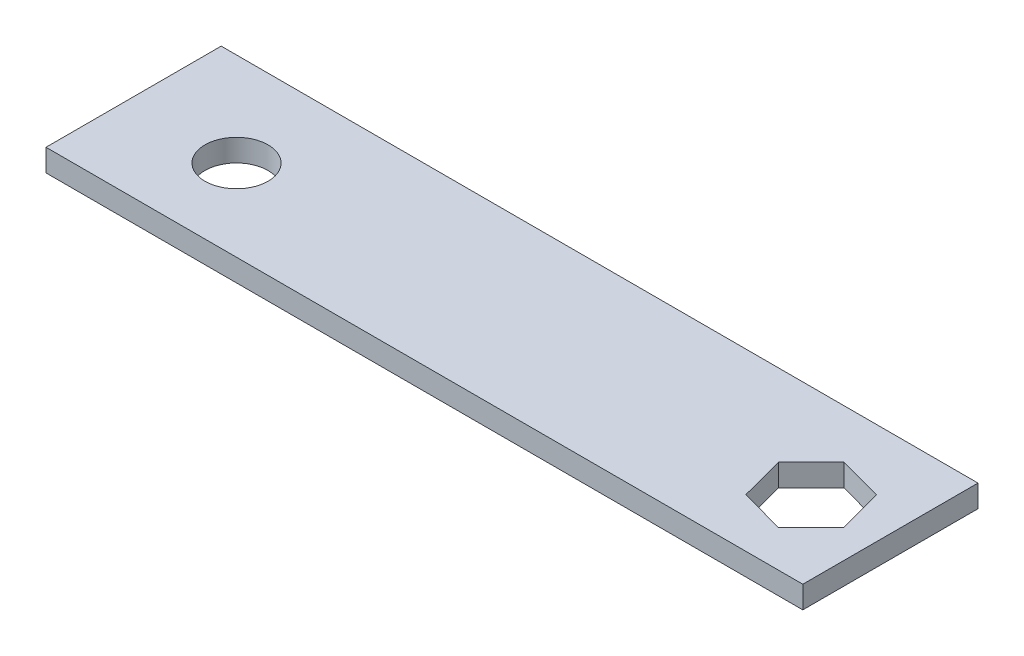
ISO-10303-21;
HEADER;
FILE_DESCRIPTION(('STEP AP214'),'2;1');
FILE_NAME('part.step','',(''),(''),'','','');
FILE_SCHEMA(('AUTOMOTIVE_DESIGN { 1 0 10303 214 1 1 1 1 }'));
ENDSEC;
DATA;
#1=APPLICATION_CONTEXT('core data for automotive mechanical design processes');
#2=APPLICATION_PROTOCOL_DEFINITION('international standard','automotive_design',2000,#1);
#3=PRODUCT_CONTEXT('',#1,'mechanical');
#4=PRODUCT('Part','Part','',(#3));
#5=PRODUCT_RELATED_PRODUCT_CATEGORY('part','',(#4));
#6=PRODUCT_DEFINITION_FORMATION('','',#4);
#7=PRODUCT_DEFINITION_CONTEXT('part definition',#1,'design');
#8=PRODUCT_DEFINITION('design','',#6,#7);
#9=PRODUCT_DEFINITION_SHAPE('','',#8);
#10=(LENGTH_UNIT() NAMED_UNIT(*) SI_UNIT(.MILLI.,.METRE.));
#11=(NAMED_UNIT(*) PLANE_ANGLE_UNIT() SI_UNIT($,.RADIAN.));
#12=(NAMED_UNIT(*) SI_UNIT($,.STERADIAN.) SOLID_ANGLE_UNIT());
#13=UNCERTAINTY_MEASURE_WITH_UNIT(LENGTH_MEASURE(1.E-05),#10,'distance_accuracy_value','');
#14=(GEOMETRIC_REPRESENTATION_CONTEXT(3) GLOBAL_UNCERTAINTY_ASSIGNED_CONTEXT((#13)) GLOBAL_UNIT_ASSIGNED_CONTEXT((#10,
#11,#12)) REPRESENTATION_CONTEXT('',''));
#15=CARTESIAN_POINT('',(0.,0.,0.));
#16=DIRECTION('',(0.,0.,1.));
#17=DIRECTION('',(1.,0.,0.));
#18=AXIS2_PLACEMENT_3D('',#15,#16,#17);
#19=CARTESIAN_POINT('',(0.,3.175,0.));
#20=DIRECTION('',(0.,-1.,0.));
#21=DIRECTION('',(0.,0.,-1.));
#22=AXIS2_PLACEMENT_3D('',#19,#20,#21);
#23=PLANE('',#22);
#24=CARTESIAN_POINT('',(15.5424302003299,3.175,-11.6447028027576));
#25=DIRECTION('',(0.,1.,0.));
#26=DIRECTION('',(0.,0.,1.));
#27=AXIS2_PLACEMENT_3D('',#24,#25,#26);
#28=CIRCLE('',#27,4.49999999995964);
#29=CARTESIAN_POINT('',(15.5424302003299,3.175,-7.14470280279791));
#30=VERTEX_POINT('',#29);
#31=EDGE_CURVE('E186',#30,#30,#28,.T.);
#32=ORIENTED_EDGE('',*,*,#31,.F.);
#33=EDGE_LOOP('',(#32));
#34=FACE_BOUND('',#33,.T.);
#35=DIRECTION('',(0.,0.,1.));
#36=VECTOR('',#35,1.);
#37=CARTESIAN_POINT('',(0.,3.175,0.));
#38=LINE('',#37,#36);
#39=CARTESIAN_POINT('',(0.,3.175,-25.));
#40=VERTEX_POINT('',#39);
#41=CARTESIAN_POINT('',(0.,3.175,0.));
#42=VERTEX_POINT('',#41);
#43=EDGE_CURVE('E194',#40,#42,#38,.T.);
#44=ORIENTED_EDGE('',*,*,#43,.T.);
#45=DIRECTION('',(1.,0.,0.));
#46=VECTOR('',#45,1.);
#47=CARTESIAN_POINT('',(0.,3.175,0.));
#48=LINE('',#47,#46);
#49=CARTESIAN_POINT('',(108.,3.175,0.));
#50=VERTEX_POINT('',#49);
#51=EDGE_CURVE('E198',#42,#50,#48,.T.);
#52=ORIENTED_EDGE('',*,*,#51,.T.);
#53=DIRECTION('',(0.,0.,-1.));
#54=VECTOR('',#53,1.);
#55=CARTESIAN_POINT('',(108.,3.175,0.));
#56=LINE('',#55,#54);
#57=CARTESIAN_POINT('',(108.,3.175,-25.));
#58=VERTEX_POINT('',#57);
#59=EDGE_CURVE('E202',#50,#58,#56,.T.);
#60=ORIENTED_EDGE('',*,*,#59,.T.);
#61=DIRECTION('',(-1.,0.,0.));
#62=VECTOR('',#61,1.);
#63=CARTESIAN_POINT('',(0.,3.175,-25.));
#64=LINE('',#63,#62);
#65=EDGE_CURVE('E205',#58,#40,#64,.T.);
#66=ORIENTED_EDGE('',*,*,#65,.T.);
#67=EDGE_LOOP('',(#44,#52,#60,#66));
#68=FACE_BOUND('',#67,.T.);
#69=DIRECTION('',(-0.965283141639287,0.,-0.261205774183859));
#70=VECTOR('',#69,1.);
#71=CARTESIAN_POINT('',(102.21569432158,3.175,-16.2949216065983));
#72=LINE('',#71,#70);
#73=CARTESIAN_POINT('',(102.21569432158,3.175,-16.2949216065983));
#74=VERTEX_POINT('',#73);
#75=CARTESIAN_POINT('',(95.8518546436722,3.175,-18.0169776522752));
#76=VERTEX_POINT('',#75);
#77=EDGE_CURVE('E117',#74,#76,#72,.T.);
#78=ORIENTED_EDGE('',*,*,#77,.F.);
#79=DIRECTION('',(-0.25643073476124,0.,-0.966562609596404));
#80=VECTOR('',#79,1.);
#81=CARTESIAN_POINT('',(103.906269878237,3.175,-9.92264675708025));
#82=LINE('',#81,#80);
#83=CARTESIAN_POINT('',(103.906269878237,3.175,-9.92264675708025));
#84=VERTEX_POINT('',#83);
#85=EDGE_CURVE('E152',#84,#74,#82,.T.);
#86=ORIENTED_EDGE('',*,*,#85,.F.);
#87=DIRECTION('',(0.708852406878046,0.,-0.705356835412546));
#88=VECTOR('',#87,1.);
#89=CARTESIAN_POINT('',(99.2330057569866,3.175,-5.27242795323908));
#90=LINE('',#89,#88);
#91=CARTESIAN_POINT('',(99.2330057569866,3.175,-5.27242795323908));
#92=VERTEX_POINT('',#91);
#93=EDGE_CURVE('E149',#92,#84,#90,.T.);
#94=ORIENTED_EDGE('',*,*,#93,.F.);
#95=DIRECTION('',(0.965283141639285,0.,0.261205774183866));
#96=VECTOR('',#95,1.);
#97=CARTESIAN_POINT('',(92.8691660790788,3.175,-6.99448399891598));
#98=LINE('',#97,#96);
#99=CARTESIAN_POINT('',(92.8691660790788,3.175,-6.99448399891598));
#100=VERTEX_POINT('',#99);
#101=EDGE_CURVE('E144',#100,#92,#98,.T.);
#102=ORIENTED_EDGE('',*,*,#101,.F.);
#103=DIRECTION('',(0.256430734761242,0.,0.966562609596404));
#104=VECTOR('',#103,1.);
#105=CARTESIAN_POINT('',(91.1785905224216,3.175,-13.366758848434));
#106=LINE('',#105,#104);
#107=CARTESIAN_POINT('',(91.1785905224216,3.175,-13.366758848434));
#108=VERTEX_POINT('',#107);
#109=EDGE_CURVE('E140',#108,#100,#106,.T.);
#110=ORIENTED_EDGE('',*,*,#109,.F.);
#111=DIRECTION('',(-0.708852406878041,0.,0.705356835412551));
#112=VECTOR('',#111,1.);
#113=CARTESIAN_POINT('',(95.8518546436722,3.175,-18.0169776522752));
#114=LINE('',#113,#112);
#115=EDGE_CURVE('E126',#76,#108,#114,.T.);
#116=ORIENTED_EDGE('',*,*,#115,.F.);
#117=EDGE_LOOP('',(#78,#86,#94,#102,#110,#116));
#118=FACE_BOUND('',#117,.T.);
#119=ADVANCED_FACE('F39',(#34,#68,#118),#23,.F.);
#120=CARTESIAN_POINT('',(0.,0.,0.));
#121=DIRECTION('',(0.,-1.,0.));
#122=DIRECTION('',(0.,0.,-1.));
#123=AXIS2_PLACEMENT_3D('',#120,#121,#122);
#124=PLANE('',#123);
#125=DIRECTION('',(0.,0.,1.));
#126=VECTOR('',#125,1.);
#127=CARTESIAN_POINT('',(0.,0.,0.));
#128=LINE('',#127,#126);
#129=CARTESIAN_POINT('',(0.,0.,-25.));
#130=VERTEX_POINT('',#129);
#131=CARTESIAN_POINT('',(0.,0.,0.));
#132=VERTEX_POINT('',#131);
#133=EDGE_CURVE('E190',#130,#132,#128,.T.);
#134=ORIENTED_EDGE('',*,*,#133,.F.);
#135=DIRECTION('',(-1.,0.,0.));
#136=VECTOR('',#135,1.);
#137=CARTESIAN_POINT('',(0.,0.,-25.));
#138=LINE('',#137,#136);
#139=CARTESIAN_POINT('',(108.,0.,-25.));
#140=VERTEX_POINT('',#139);
#141=EDGE_CURVE('E199',#140,#130,#138,.T.);
#142=ORIENTED_EDGE('',*,*,#141,.F.);
#143=DIRECTION('',(0.,0.,-1.));
#144=VECTOR('',#143,1.);
#145=CARTESIAN_POINT('',(108.,0.,0.));
#146=LINE('',#145,#144);
#147=CARTESIAN_POINT('',(108.,0.,0.));
#148=VERTEX_POINT('',#147);
#149=EDGE_CURVE('E215',#148,#140,#146,.T.);
#150=ORIENTED_EDGE('',*,*,#149,.F.);
#151=DIRECTION('',(1.,0.,0.));
#152=VECTOR('',#151,1.);
#153=CARTESIAN_POINT('',(0.,0.,0.));
#154=LINE('',#153,#152);
#155=EDGE_CURVE('E212',#132,#148,#154,.T.);
#156=ORIENTED_EDGE('',*,*,#155,.F.);
#157=EDGE_LOOP('',(#134,#142,#150,#156));
#158=FACE_BOUND('',#157,.T.);
#159=CARTESIAN_POINT('',(15.5424302003299,0.,-11.6447028027576));
#160=DIRECTION('',(0.,1.,0.));
#161=DIRECTION('',(0.,0.,1.));
#162=AXIS2_PLACEMENT_3D('',#159,#160,#161);
#163=CIRCLE('',#162,4.49999999995964);
#164=CARTESIAN_POINT('',(15.5424302003299,0.,-7.14470280279791));
#165=VERTEX_POINT('',#164);
#166=EDGE_CURVE('E135',#165,#165,#163,.T.);
#167=ORIENTED_EDGE('',*,*,#166,.T.);
#168=EDGE_LOOP('',(#167));
#169=FACE_BOUND('',#168,.T.);
#170=DIRECTION('',(-0.25643073476124,0.,-0.966562609596404));
#171=VECTOR('',#170,1.);
#172=CARTESIAN_POINT('',(103.906269878237,0.,-9.92264675708025));
#173=LINE('',#172,#171);
#174=CARTESIAN_POINT('',(103.906269878237,0.,-9.92264675708025));
#175=VERTEX_POINT('',#174);
#176=CARTESIAN_POINT('',(102.21569432158,0.,-16.2949216065983));
#177=VERTEX_POINT('',#176);
#178=EDGE_CURVE('E127',#175,#177,#173,.T.);
#179=ORIENTED_EDGE('',*,*,#178,.T.);
#180=DIRECTION('',(-0.965283141639287,0.,-0.261205774183859));
#181=VECTOR('',#180,1.);
#182=CARTESIAN_POINT('',(102.21569432158,0.,-16.2949216065983));
#183=LINE('',#182,#181);
#184=CARTESIAN_POINT('',(95.8518546436722,0.,-18.0169776522752));
#185=VERTEX_POINT('',#184);
#186=EDGE_CURVE('E63',#177,#185,#183,.T.);
#187=ORIENTED_EDGE('',*,*,#186,.T.);
#188=DIRECTION('',(-0.708852406878041,0.,0.705356835412551));
#189=VECTOR('',#188,1.);
#190=CARTESIAN_POINT('',(95.8518546436722,0.,-18.0169776522752));
#191=LINE('',#190,#189);
#192=CARTESIAN_POINT('',(91.1785905224216,0.,-13.366758848434));
#193=VERTEX_POINT('',#192);
#194=EDGE_CURVE('E133',#185,#193,#191,.T.);
#195=ORIENTED_EDGE('',*,*,#194,.T.);
#196=DIRECTION('',(0.256430734761242,0.,0.966562609596404));
#197=VECTOR('',#196,1.);
#198=CARTESIAN_POINT('',(91.1785905224216,0.,-13.366758848434));
#199=LINE('',#198,#197);
#200=CARTESIAN_POINT('',(92.8691660790788,0.,-6.99448399891598));
#201=VERTEX_POINT('',#200);
#202=EDGE_CURVE('E159',#193,#201,#199,.T.);
#203=ORIENTED_EDGE('',*,*,#202,.T.);
#204=DIRECTION('',(0.965283141639285,0.,0.261205774183866));
#205=VECTOR('',#204,1.);
#206=CARTESIAN_POINT('',(92.8691660790788,0.,-6.99448399891598));
#207=LINE('',#206,#205);
#208=CARTESIAN_POINT('',(99.2330057569866,0.,-5.27242795323908));
#209=VERTEX_POINT('',#208);
#210=EDGE_CURVE('E163',#201,#209,#207,.T.);
#211=ORIENTED_EDGE('',*,*,#210,.T.);
#212=DIRECTION('',(0.708852406878046,0.,-0.705356835412546));
#213=VECTOR('',#212,1.);
#214=CARTESIAN_POINT('',(99.2330057569866,0.,-5.27242795323908));
#215=LINE('',#214,#213);
#216=EDGE_CURVE('E167',#209,#175,#215,.T.);
#217=ORIENTED_EDGE('',*,*,#216,.T.);
#218=EDGE_LOOP('',(#179,#187,#195,#203,#211,#217));
#219=FACE_BOUND('',#218,.T.);
#220=ADVANCED_FACE('F238',(#158,#169,#219),#124,.T.);
#221=CARTESIAN_POINT('',(0.,3.175,0.));
#222=DIRECTION('',(1.,0.,0.));
#223=DIRECTION('',(0.,0.,-1.));
#224=AXIS2_PLACEMENT_3D('',#221,#222,#223);
#225=PLANE('',#224);
#226=ORIENTED_EDGE('',*,*,#133,.T.);
#227=DIRECTION('',(0.,-1.,0.));
#228=VECTOR('',#227,1.);
#229=CARTESIAN_POINT('',(0.,3.175,0.));
#230=LINE('',#229,#228);
#231=EDGE_CURVE('E11',#42,#132,#230,.T.);
#232=ORIENTED_EDGE('',*,*,#231,.F.);
#233=ORIENTED_EDGE('',*,*,#43,.F.);
#234=DIRECTION('',(0.,-1.,0.));
#235=VECTOR('',#234,1.);
#236=CARTESIAN_POINT('',(0.,3.175,-25.));
#237=LINE('',#236,#235);
#238=EDGE_CURVE('E208',#40,#130,#237,.T.);
#239=ORIENTED_EDGE('',*,*,#238,.T.);
#240=EDGE_LOOP('',(#226,#232,#233,#239));
#241=FACE_BOUND('',#240,.T.);
#242=ADVANCED_FACE('F41',(#241),#225,.F.);
#243=CARTESIAN_POINT('',(0.,3.175,0.));
#244=DIRECTION('',(0.,0.,-1.));
#245=DIRECTION('',(-1.,0.,0.));
#246=AXIS2_PLACEMENT_3D('',#243,#244,#245);
#247=PLANE('',#246);
#248=ORIENTED_EDGE('',*,*,#155,.T.);
#249=DIRECTION('',(0.,-1.,0.));
#250=VECTOR('',#249,1.);
#251=CARTESIAN_POINT('',(108.,3.175,0.));
#252=LINE('',#251,#250);
#253=EDGE_CURVE('E48',#50,#148,#252,.T.);
#254=ORIENTED_EDGE('',*,*,#253,.F.);
#255=ORIENTED_EDGE('',*,*,#51,.F.);
#256=ORIENTED_EDGE('',*,*,#231,.T.);
#257=EDGE_LOOP('',(#248,#254,#255,#256));
#258=FACE_BOUND('',#257,.T.);
#259=ADVANCED_FACE('F248',(#258),#247,.F.);
#260=CARTESIAN_POINT('',(108.,3.175,0.));
#261=DIRECTION('',(-1.,0.,0.));
#262=DIRECTION('',(0.,0.,1.));
#263=AXIS2_PLACEMENT_3D('',#260,#261,#262);
#264=PLANE('',#263);
#265=ORIENTED_EDGE('',*,*,#149,.T.);
#266=DIRECTION('',(0.,-1.,0.));
#267=VECTOR('',#266,1.);
#268=CARTESIAN_POINT('',(108.,3.175,-25.));
#269=LINE('',#268,#267);
#270=EDGE_CURVE('E223',#58,#140,#269,.T.);
#271=ORIENTED_EDGE('',*,*,#270,.F.);
#272=ORIENTED_EDGE('',*,*,#59,.F.);
#273=ORIENTED_EDGE('',*,*,#253,.T.);
#274=EDGE_LOOP('',(#265,#271,#272,#273));
#275=FACE_BOUND('',#274,.T.);
#276=ADVANCED_FACE('F232',(#275),#264,.F.);
#277=CARTESIAN_POINT('',(0.,3.175,-25.));
#278=DIRECTION('',(0.,0.,1.));
#279=DIRECTION('',(1.,0.,0.));
#280=AXIS2_PLACEMENT_3D('',#277,#278,#279);
#281=PLANE('',#280);
#282=ORIENTED_EDGE('',*,*,#141,.T.);
#283=ORIENTED_EDGE('',*,*,#238,.F.);
#284=ORIENTED_EDGE('',*,*,#65,.F.);
#285=ORIENTED_EDGE('',*,*,#270,.T.);
#286=EDGE_LOOP('',(#282,#283,#284,#285));
#287=FACE_BOUND('',#286,.T.);
#288=ADVANCED_FACE('F242',(#287),#281,.F.);
#289=CARTESIAN_POINT('',(15.5424302003299,3.175,-11.6447028027576));
#290=DIRECTION('',(0.,-1.,0.));
#291=DIRECTION('',(0.,0.,-1.));
#292=AXIS2_PLACEMENT_3D('',#289,#290,#291);
#293=CYLINDRICAL_SURFACE('',#292,4.49999999995964);
#294=ORIENTED_EDGE('',*,*,#31,.T.);
#295=EDGE_LOOP('',(#294));
#296=FACE_BOUND('',#295,.T.);
#297=ORIENTED_EDGE('',*,*,#166,.F.);
#298=EDGE_LOOP('',(#297));
#299=FACE_BOUND('',#298,.T.);
#300=ADVANCED_FACE('F264',(#296,#299),#293,.F.);
#301=CARTESIAN_POINT('',(102.21569432158,3.175,-16.2949216065983));
#302=DIRECTION('',(-0.261205774183859,0.,0.965283141639286));
#303=DIRECTION('',(0.965283141639287,0.,0.261205774183859));
#304=AXIS2_PLACEMENT_3D('',#301,#302,#303);
#305=PLANE('',#304);
#306=ORIENTED_EDGE('',*,*,#186,.F.);
#307=DIRECTION('',(0.,-1.,0.));
#308=VECTOR('',#307,1.);
#309=CARTESIAN_POINT('',(102.21569432158,3.175,-16.2949216065983));
#310=LINE('',#309,#308);
#311=EDGE_CURVE('E121',#74,#177,#310,.T.);
#312=ORIENTED_EDGE('',*,*,#311,.F.);
#313=ORIENTED_EDGE('',*,*,#77,.T.);
#314=DIRECTION('',(0.,-1.,0.));
#315=VECTOR('',#314,1.);
#316=CARTESIAN_POINT('',(95.8518546436722,3.175,-18.0169776522752));
#317=LINE('',#316,#315);
#318=EDGE_CURVE('E120',#76,#185,#317,.T.);
#319=ORIENTED_EDGE('',*,*,#318,.T.);
#320=EDGE_LOOP('',(#306,#312,#313,#319));
#321=FACE_BOUND('',#320,.T.);
#322=ADVANCED_FACE('F119',(#321),#305,.T.);
#323=CARTESIAN_POINT('',(95.8518546436722,3.175,-18.0169776522752));
#324=DIRECTION('',(0.705356835412551,0.,0.708852406878041));
#325=DIRECTION('',(0.708852406878041,0.,-0.705356835412551));
#326=AXIS2_PLACEMENT_3D('',#323,#324,#325);
#327=PLANE('',#326);
#328=ORIENTED_EDGE('',*,*,#194,.F.);
#329=ORIENTED_EDGE('',*,*,#318,.F.);
#330=ORIENTED_EDGE('',*,*,#115,.T.);
#331=DIRECTION('',(0.,-1.,0.));
#332=VECTOR('',#331,1.);
#333=CARTESIAN_POINT('',(91.1785905224216,3.175,-13.366758848434));
#334=LINE('',#333,#332);
#335=EDGE_CURVE('E136',#108,#193,#334,.T.);
#336=ORIENTED_EDGE('',*,*,#335,.T.);
#337=EDGE_LOOP('',(#328,#329,#330,#336));
#338=FACE_BOUND('',#337,.T.);
#339=ADVANCED_FACE('F130',(#338),#327,.T.);
#340=CARTESIAN_POINT('',(91.1785905224216,3.175,-13.366758848434));
#341=DIRECTION('',(0.966562609596403,0.,-0.256430734761242));
#342=DIRECTION('',(-0.256430734761242,0.,-0.966562609596403));
#343=AXIS2_PLACEMENT_3D('',#340,#341,#342);
#344=PLANE('',#343);
#345=ORIENTED_EDGE('',*,*,#202,.F.);
#346=ORIENTED_EDGE('',*,*,#335,.F.);
#347=ORIENTED_EDGE('',*,*,#109,.T.);
#348=DIRECTION('',(0.,-1.,0.));
#349=VECTOR('',#348,1.);
#350=CARTESIAN_POINT('',(92.8691660790788,3.175,-6.99448399891598));
#351=LINE('',#350,#349);
#352=EDGE_CURVE('E181',#100,#201,#351,.T.);
#353=ORIENTED_EDGE('',*,*,#352,.T.);
#354=EDGE_LOOP('',(#345,#346,#347,#353));
#355=FACE_BOUND('',#354,.T.);
#356=ADVANCED_FACE('F290',(#355),#344,.T.);
#357=CARTESIAN_POINT('',(92.8691660790788,3.175,-6.99448399891598));
#358=DIRECTION('',(0.261205774183866,0.,-0.965283141639285));
#359=DIRECTION('',(-0.965283141639285,0.,-0.261205774183866));
#360=AXIS2_PLACEMENT_3D('',#357,#358,#359);
#361=PLANE('',#360);
#362=ORIENTED_EDGE('',*,*,#210,.F.);
#363=ORIENTED_EDGE('',*,*,#352,.F.);
#364=ORIENTED_EDGE('',*,*,#101,.T.);
#365=DIRECTION('',(0.,-1.,0.));
#366=VECTOR('',#365,1.);
#367=CARTESIAN_POINT('',(99.2330057569866,3.175,-5.27242795323908));
#368=LINE('',#367,#366);
#369=EDGE_CURVE('E178',#92,#209,#368,.T.);
#370=ORIENTED_EDGE('',*,*,#369,.T.);
#371=EDGE_LOOP('',(#362,#363,#364,#370));
#372=FACE_BOUND('',#371,.T.);
#373=ADVANCED_FACE('F286',(#372),#361,.T.);
#374=CARTESIAN_POINT('',(99.2330057569866,3.175,-5.27242795323908));
#375=DIRECTION('',(-0.705356835412546,0.,-0.708852406878046));
#376=DIRECTION('',(-0.708852406878046,0.,0.705356835412546));
#377=AXIS2_PLACEMENT_3D('',#374,#375,#376);
#378=PLANE('',#377);
#379=ORIENTED_EDGE('',*,*,#216,.F.);
#380=ORIENTED_EDGE('',*,*,#369,.F.);
#381=ORIENTED_EDGE('',*,*,#93,.T.);
#382=DIRECTION('',(0.,-1.,0.));
#383=VECTOR('',#382,1.);
#384=CARTESIAN_POINT('',(103.906269878237,3.175,-9.92264675708025));
#385=LINE('',#384,#383);
#386=EDGE_CURVE('E55',#84,#175,#385,.T.);
#387=ORIENTED_EDGE('',*,*,#386,.T.);
#388=EDGE_LOOP('',(#379,#380,#381,#387));
#389=FACE_BOUND('',#388,.T.);
#390=ADVANCED_FACE('F283',(#389),#378,.T.);
#391=CARTESIAN_POINT('',(103.906269878237,3.175,-9.92264675708025));
#392=DIRECTION('',(-0.966562609596404,0.,0.25643073476124));
#393=DIRECTION('',(0.25643073476124,0.,0.966562609596404));
#394=AXIS2_PLACEMENT_3D('',#391,#392,#393);
#395=PLANE('',#394);
#396=ORIENTED_EDGE('',*,*,#178,.F.);
#397=ORIENTED_EDGE('',*,*,#386,.F.);
#398=ORIENTED_EDGE('',*,*,#85,.T.);
#399=ORIENTED_EDGE('',*,*,#311,.T.);
#400=EDGE_LOOP('',(#396,#397,#398,#399));
#401=FACE_BOUND('',#400,.T.);
#402=ADVANCED_FACE('F279',(#401),#395,.T.);
#403=CLOSED_SHELL('',(#119,#220,#242,#259,#276,#288,#300,#322,#339,#356,#373,#390,#402));
#404=MANIFOLD_SOLID_BREP('B2',#403);
#405=ADVANCED_BREP_SHAPE_REPRESENTATION('',(#18,#404),#14);
#406=SHAPE_DEFINITION_REPRESENTATION(#9,#405);
ENDSEC;
END-ISO-10303-21;
